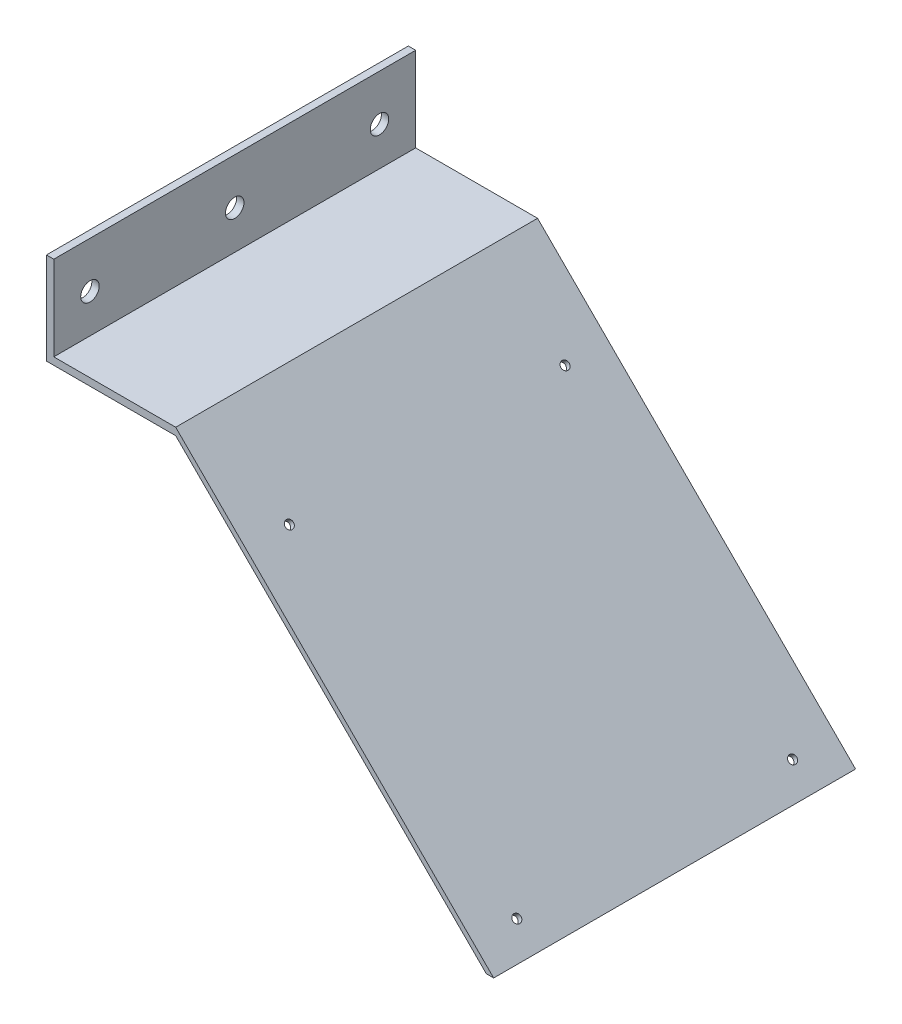
ISO-10303-21;
HEADER;
FILE_DESCRIPTION(('STEP AP214'),'2;1');
FILE_NAME('part.step','',(''),(''),'','','');
FILE_SCHEMA(('AUTOMOTIVE_DESIGN { 1 0 10303 214 1 1 1 1 }'));
ENDSEC;
DATA;
#1=APPLICATION_CONTEXT('core data for automotive mechanical design processes');
#2=APPLICATION_PROTOCOL_DEFINITION('international standard','automotive_design',2000,#1);
#3=PRODUCT_CONTEXT('',#1,'mechanical');
#4=PRODUCT('Part','Part','',(#3));
#5=PRODUCT_RELATED_PRODUCT_CATEGORY('part','',(#4));
#6=PRODUCT_DEFINITION_FORMATION('','',#4);
#7=PRODUCT_DEFINITION_CONTEXT('part definition',#1,'design');
#8=PRODUCT_DEFINITION('design','',#6,#7);
#9=PRODUCT_DEFINITION_SHAPE('','',#8);
#10=(LENGTH_UNIT() NAMED_UNIT(*) SI_UNIT(.MILLI.,.METRE.));
#11=(NAMED_UNIT(*) PLANE_ANGLE_UNIT() SI_UNIT($,.RADIAN.));
#12=(NAMED_UNIT(*) SI_UNIT($,.STERADIAN.) SOLID_ANGLE_UNIT());
#13=UNCERTAINTY_MEASURE_WITH_UNIT(LENGTH_MEASURE(1.E-05),#10,'distance_accuracy_value','');
#14=(GEOMETRIC_REPRESENTATION_CONTEXT(3) GLOBAL_UNCERTAINTY_ASSIGNED_CONTEXT((#13)) GLOBAL_UNIT_ASSIGNED_CONTEXT((#10,
#11,#12)) REPRESENTATION_CONTEXT('',''));
#15=CARTESIAN_POINT('',(0.,0.,0.));
#16=DIRECTION('',(0.,0.,1.));
#17=DIRECTION('',(1.,0.,0.));
#18=AXIS2_PLACEMENT_3D('',#15,#16,#17);
#19=CARTESIAN_POINT('',(0.,2.032,100.));
#20=DIRECTION('',(0.,-1.,0.));
#21=DIRECTION('',(1.,0.,0.));
#22=AXIS2_PLACEMENT_3D('',#19,#20,#21);
#23=PLANE('',#22);
#24=DIRECTION('',(-1.,0.,0.));
#25=VECTOR('',#24,1.);
#26=CARTESIAN_POINT('',(0.,2.032,0.));
#27=LINE('',#26,#25);
#28=CARTESIAN_POINT('',(0.,2.032,0.));
#29=VERTEX_POINT('',#28);
#30=CARTESIAN_POINT('',(-33.68957,2.032,0.));
#31=VERTEX_POINT('',#30);
#32=EDGE_CURVE('E150',#29,#31,#27,.T.);
#33=ORIENTED_EDGE('',*,*,#32,.T.);
#34=DIRECTION('',(0.,0.,-1.));
#35=VECTOR('',#34,1.);
#36=CARTESIAN_POINT('',(-33.68957,2.032,100.));
#37=LINE('',#36,#35);
#38=CARTESIAN_POINT('',(-33.68957,2.032,100.));
#39=VERTEX_POINT('',#38);
#40=EDGE_CURVE('E11',#39,#31,#37,.T.);
#41=ORIENTED_EDGE('',*,*,#40,.F.);
#42=DIRECTION('',(-1.,0.,0.));
#43=VECTOR('',#42,1.);
#44=CARTESIAN_POINT('',(0.,2.032,100.));
#45=LINE('',#44,#43);
#46=CARTESIAN_POINT('',(0.,2.032,100.));
#47=VERTEX_POINT('',#46);
#48=EDGE_CURVE('E177',#47,#39,#45,.T.);
#49=ORIENTED_EDGE('',*,*,#48,.F.);
#50=DIRECTION('',(0.,0.,-1.));
#51=VECTOR('',#50,1.);
#52=CARTESIAN_POINT('',(0.,2.032,100.));
#53=LINE('',#52,#51);
#54=EDGE_CURVE('E146',#47,#29,#53,.T.);
#55=ORIENTED_EDGE('',*,*,#54,.T.);
#56=EDGE_LOOP('',(#33,#41,#49,#55));
#57=FACE_BOUND('',#56,.T.);
#58=ADVANCED_FACE('F49',(#57),#23,.F.);
#59=CARTESIAN_POINT('',(-33.68957,0.,100.));
#60=DIRECTION('',(-1.,0.,0.));
#61=DIRECTION('',(0.,0.,1.));
#62=AXIS2_PLACEMENT_3D('',#59,#60,#61);
#63=PLANE('',#62);
#64=CARTESIAN_POINT('',(-33.68957,12.7,10.));
#65=DIRECTION('',(-1.,0.,0.));
#66=DIRECTION('',(0.,0.,1.));
#67=AXIS2_PLACEMENT_3D('',#64,#65,#66);
#68=CIRCLE('',#67,2.55269999999999);
#69=CARTESIAN_POINT('',(-33.68957,12.7,12.5527));
#70=VERTEX_POINT('',#69);
#71=EDGE_CURVE('E310',#70,#70,#68,.T.);
#72=ORIENTED_EDGE('',*,*,#71,.T.);
#73=EDGE_LOOP('',(#72));
#74=FACE_BOUND('',#73,.T.);
#75=CARTESIAN_POINT('',(-33.68957,12.7,50.));
#76=DIRECTION('',(-1.,0.,0.));
#77=DIRECTION('',(0.,0.,1.));
#78=AXIS2_PLACEMENT_3D('',#75,#76,#77);
#79=CIRCLE('',#78,2.55269999999999);
#80=CARTESIAN_POINT('',(-33.68957,12.7,52.5527));
#81=VERTEX_POINT('',#80);
#82=EDGE_CURVE('E302',#81,#81,#79,.T.);
#83=ORIENTED_EDGE('',*,*,#82,.T.);
#84=EDGE_LOOP('',(#83));
#85=FACE_BOUND('',#84,.T.);
#86=CARTESIAN_POINT('',(-33.68957,12.7,90.));
#87=DIRECTION('',(-1.,0.,0.));
#88=DIRECTION('',(0.,0.,1.));
#89=AXIS2_PLACEMENT_3D('',#86,#87,#88);
#90=CIRCLE('',#89,2.55269999999999);
#91=CARTESIAN_POINT('',(-33.68957,12.7,92.5527));
#92=VERTEX_POINT('',#91);
#93=EDGE_CURVE('E294',#92,#92,#90,.T.);
#94=ORIENTED_EDGE('',*,*,#93,.T.);
#95=EDGE_LOOP('',(#94));
#96=FACE_BOUND('',#95,.T.);
#97=DIRECTION('',(0.,1.,0.));
#98=VECTOR('',#97,1.);
#99=CARTESIAN_POINT('',(-33.68957,0.,0.));
#100=LINE('',#99,#98);
#101=CARTESIAN_POINT('',(-33.68957,25.4,0.));
#102=VERTEX_POINT('',#101);
#103=EDGE_CURVE('E154',#31,#102,#100,.T.);
#104=ORIENTED_EDGE('',*,*,#103,.T.);
#105=DIRECTION('',(0.,0.,-1.));
#106=VECTOR('',#105,1.);
#107=CARTESIAN_POINT('',(-33.68957,25.4,100.));
#108=LINE('',#107,#106);
#109=CARTESIAN_POINT('',(-33.68957,25.4,100.));
#110=VERTEX_POINT('',#109);
#111=EDGE_CURVE('E58',#110,#102,#108,.T.);
#112=ORIENTED_EDGE('',*,*,#111,.F.);
#113=DIRECTION('',(0.,1.,0.));
#114=VECTOR('',#113,1.);
#115=CARTESIAN_POINT('',(-33.68957,0.,100.));
#116=LINE('',#115,#114);
#117=EDGE_CURVE('E109',#39,#110,#116,.T.);
#118=ORIENTED_EDGE('',*,*,#117,.F.);
#119=ORIENTED_EDGE('',*,*,#40,.T.);
#120=EDGE_LOOP('',(#104,#112,#118,#119));
#121=FACE_BOUND('',#120,.T.);
#122=ADVANCED_FACE('F196',(#74,#85,#96,#121),#63,.F.);
#123=CARTESIAN_POINT('',(0.,25.4,100.));
#124=DIRECTION('',(0.,1.,0.));
#125=DIRECTION('',(0.,0.,1.));
#126=AXIS2_PLACEMENT_3D('',#123,#124,#125);
#127=PLANE('',#126);
#128=DIRECTION('',(1.,0.,0.));
#129=VECTOR('',#128,1.);
#130=CARTESIAN_POINT('',(0.,25.4,0.));
#131=LINE('',#130,#129);
#132=CARTESIAN_POINT('',(-35.72157,25.4,0.));
#133=VERTEX_POINT('',#132);
#134=EDGE_CURVE('E159',#133,#102,#131,.T.);
#135=ORIENTED_EDGE('',*,*,#134,.F.);
#136=DIRECTION('',(0.,0.,-1.));
#137=VECTOR('',#136,1.);
#138=CARTESIAN_POINT('',(-35.72157,25.4,100.));
#139=LINE('',#138,#137);
#140=CARTESIAN_POINT('',(-35.72157,25.4,100.));
#141=VERTEX_POINT('',#140);
#142=EDGE_CURVE('E187',#141,#133,#139,.T.);
#143=ORIENTED_EDGE('',*,*,#142,.F.);
#144=DIRECTION('',(1.,0.,0.));
#145=VECTOR('',#144,1.);
#146=CARTESIAN_POINT('',(0.,25.4,100.));
#147=LINE('',#146,#145);
#148=EDGE_CURVE('E195',#141,#110,#147,.T.);
#149=ORIENTED_EDGE('',*,*,#148,.T.);
#150=ORIENTED_EDGE('',*,*,#111,.T.);
#151=EDGE_LOOP('',(#135,#143,#149,#150));
#152=FACE_BOUND('',#151,.T.);
#153=ADVANCED_FACE('F193',(#152),#127,.T.);
#154=CARTESIAN_POINT('',(-35.72157,0.,100.));
#155=DIRECTION('',(-1.,0.,0.));
#156=DIRECTION('',(0.,0.,1.));
#157=AXIS2_PLACEMENT_3D('',#154,#155,#156);
#158=PLANE('',#157);
#159=CARTESIAN_POINT('',(-35.72157,12.7,10.));
#160=DIRECTION('',(-1.,0.,0.));
#161=DIRECTION('',(0.,0.,1.));
#162=AXIS2_PLACEMENT_3D('',#159,#160,#161);
#163=CIRCLE('',#162,2.5527);
#164=CARTESIAN_POINT('',(-35.72157,12.7,12.5527));
#165=VERTEX_POINT('',#164);
#166=EDGE_CURVE('E313',#165,#165,#163,.T.);
#167=ORIENTED_EDGE('',*,*,#166,.F.);
#168=EDGE_LOOP('',(#167));
#169=FACE_BOUND('',#168,.T.);
#170=CARTESIAN_POINT('',(-35.72157,12.7,50.));
#171=DIRECTION('',(-1.,0.,0.));
#172=DIRECTION('',(0.,0.,1.));
#173=AXIS2_PLACEMENT_3D('',#170,#171,#172);
#174=CIRCLE('',#173,2.5527);
#175=CARTESIAN_POINT('',(-35.72157,12.7,52.5527));
#176=VERTEX_POINT('',#175);
#177=EDGE_CURVE('E306',#176,#176,#174,.T.);
#178=ORIENTED_EDGE('',*,*,#177,.F.);
#179=EDGE_LOOP('',(#178));
#180=FACE_BOUND('',#179,.T.);
#181=CARTESIAN_POINT('',(-35.72157,12.7,90.));
#182=DIRECTION('',(-1.,0.,0.));
#183=DIRECTION('',(0.,0.,1.));
#184=AXIS2_PLACEMENT_3D('',#181,#182,#183);
#185=CIRCLE('',#184,2.5527);
#186=CARTESIAN_POINT('',(-35.72157,12.7,92.5527));
#187=VERTEX_POINT('',#186);
#188=EDGE_CURVE('E298',#187,#187,#185,.T.);
#189=ORIENTED_EDGE('',*,*,#188,.F.);
#190=EDGE_LOOP('',(#189));
#191=FACE_BOUND('',#190,.T.);
#192=DIRECTION('',(0.,1.,0.));
#193=VECTOR('',#192,1.);
#194=CARTESIAN_POINT('',(-35.72157,0.,0.));
#195=LINE('',#194,#193);
#196=CARTESIAN_POINT('',(-35.72157,0.,0.));
#197=VERTEX_POINT('',#196);
#198=EDGE_CURVE('E163',#197,#133,#195,.T.);
#199=ORIENTED_EDGE('',*,*,#198,.F.);
#200=DIRECTION('',(0.,0.,-1.));
#201=VECTOR('',#200,1.);
#202=CARTESIAN_POINT('',(-35.72157,0.,100.));
#203=LINE('',#202,#201);
#204=CARTESIAN_POINT('',(-35.72157,0.,100.));
#205=VERTEX_POINT('',#204);
#206=EDGE_CURVE('E184',#205,#197,#203,.T.);
#207=ORIENTED_EDGE('',*,*,#206,.F.);
#208=DIRECTION('',(0.,1.,0.));
#209=VECTOR('',#208,1.);
#210=CARTESIAN_POINT('',(-35.72157,0.,100.));
#211=LINE('',#210,#209);
#212=EDGE_CURVE('E206',#205,#141,#211,.T.);
#213=ORIENTED_EDGE('',*,*,#212,.T.);
#214=ORIENTED_EDGE('',*,*,#142,.T.);
#215=EDGE_LOOP('',(#199,#207,#213,#214));
#216=FACE_BOUND('',#215,.T.);
#217=ADVANCED_FACE('F204',(#169,#180,#191,#216),#158,.T.);
#218=CARTESIAN_POINT('',(0.,0.,100.));
#219=DIRECTION('',(0.,-1.,0.));
#220=DIRECTION('',(1.,0.,0.));
#221=AXIS2_PLACEMENT_3D('',#218,#219,#220);
#222=PLANE('',#221);
#223=DIRECTION('',(-1.,0.,0.));
#224=VECTOR('',#223,1.);
#225=CARTESIAN_POINT('',(0.,0.,0.));
#226=LINE('',#225,#224);
#227=CARTESIAN_POINT('',(0.,0.,0.));
#228=VERTEX_POINT('',#227);
#229=EDGE_CURVE('E167',#228,#197,#226,.T.);
#230=ORIENTED_EDGE('',*,*,#229,.F.);
#231=DIRECTION('',(0.,0.,-1.));
#232=VECTOR('',#231,1.);
#233=CARTESIAN_POINT('',(0.,0.,100.));
#234=LINE('',#233,#232);
#235=CARTESIAN_POINT('',(0.,0.,100.));
#236=VERTEX_POINT('',#235);
#237=EDGE_CURVE('E139',#236,#228,#234,.T.);
#238=ORIENTED_EDGE('',*,*,#237,.F.);
#239=DIRECTION('',(-1.,0.,0.));
#240=VECTOR('',#239,1.);
#241=CARTESIAN_POINT('',(0.,0.,100.));
#242=LINE('',#241,#240);
#243=EDGE_CURVE('E130',#236,#205,#242,.T.);
#244=ORIENTED_EDGE('',*,*,#243,.T.);
#245=ORIENTED_EDGE('',*,*,#206,.T.);
#246=EDGE_LOOP('',(#230,#238,#244,#245));
#247=FACE_BOUND('',#246,.T.);
#248=ADVANCED_FACE('F216',(#247),#222,.T.);
#249=CARTESIAN_POINT('',(0.,0.,100.));
#250=DIRECTION('',(0.707106781186546,0.707106781186549,0.));
#251=DIRECTION('',(-0.707106781186549,0.707106781186546,0.));
#252=AXIS2_PLACEMENT_3D('',#249,#250,#251);
#253=PLANE('',#252);
#254=CARTESIAN_POINT('',(18.4816506323928,-18.4816506323927,88.1));
#255=DIRECTION('',(0.707106781186546,0.707106781186549,0.));
#256=DIRECTION('',(-0.707106781186549,0.707106781186546,0.));
#257=AXIS2_PLACEMENT_3D('',#254,#255,#256);
#258=CIRCLE('',#257,1.13029999999999);
#259=CARTESIAN_POINT('',(17.6824078376176,-17.6824078376175,88.1));
#260=VERTEX_POINT('',#259);
#261=EDGE_CURVE('E256',#260,#260,#258,.T.);
#262=ORIENTED_EDGE('',*,*,#261,.T.);
#263=EDGE_LOOP('',(#262));
#264=FACE_BOUND('',#263,.T.);
#265=CARTESIAN_POINT('',(18.4816506323928,-18.4816506323927,11.9));
#266=DIRECTION('',(0.707106781186546,0.707106781186549,0.));
#267=DIRECTION('',(-0.707106781186549,0.707106781186546,0.));
#268=AXIS2_PLACEMENT_3D('',#265,#266,#267);
#269=CIRCLE('',#268,1.13029999999999);
#270=CARTESIAN_POINT('',(17.6824078376176,-17.6824078376175,11.9));
#271=VERTEX_POINT('',#270);
#272=EDGE_CURVE('E260',#271,#271,#269,.T.);
#273=ORIENTED_EDGE('',*,*,#272,.T.);
#274=EDGE_LOOP('',(#273));
#275=FACE_BOUND('',#274,.T.);
#276=CARTESIAN_POINT('',(81.343443479877,-81.3434434798766,11.9));
#277=DIRECTION('',(0.707106781186546,0.707106781186549,0.));
#278=DIRECTION('',(-0.707106781186549,0.707106781186546,0.));
#279=AXIS2_PLACEMENT_3D('',#276,#277,#278);
#280=CIRCLE('',#279,1.13029999999999);
#281=CARTESIAN_POINT('',(80.5442006851018,-80.5442006851015,11.9));
#282=VERTEX_POINT('',#281);
#283=EDGE_CURVE('E264',#282,#282,#280,.T.);
#284=ORIENTED_EDGE('',*,*,#283,.T.);
#285=EDGE_LOOP('',(#284));
#286=FACE_BOUND('',#285,.T.);
#287=CARTESIAN_POINT('',(81.343443479877,-81.3434434798766,88.1));
#288=DIRECTION('',(0.707106781186546,0.707106781186549,0.));
#289=DIRECTION('',(-0.707106781186549,0.707106781186546,0.));
#290=AXIS2_PLACEMENT_3D('',#287,#288,#289);
#291=CIRCLE('',#290,1.13029999999999);
#292=CARTESIAN_POINT('',(80.5442006851018,-80.5442006851015,88.1));
#293=VERTEX_POINT('',#292);
#294=EDGE_CURVE('E155',#293,#293,#291,.T.);
#295=ORIENTED_EDGE('',*,*,#294,.T.);
#296=EDGE_LOOP('',(#295));
#297=FACE_BOUND('',#296,.T.);
#298=DIRECTION('',(0.707106781186549,-0.707106781186546,0.));
#299=VECTOR('',#298,1.);
#300=CARTESIAN_POINT('',(0.,0.,0.));
#301=LINE('',#300,#299);
#302=CARTESIAN_POINT('',(85.8335708478916,-85.8335708478913,0.));
#303=VERTEX_POINT('',#302);
#304=EDGE_CURVE('E137',#228,#303,#301,.T.);
#305=ORIENTED_EDGE('',*,*,#304,.T.);
#306=DIRECTION('',(0.,0.,-1.));
#307=VECTOR('',#306,1.);
#308=CARTESIAN_POINT('',(85.8335708478916,-85.8335708478913,100.));
#309=LINE('',#308,#307);
#310=CARTESIAN_POINT('',(85.8335708478916,-85.8335708478913,100.));
#311=VERTEX_POINT('',#310);
#312=EDGE_CURVE('E134',#311,#303,#309,.T.);
#313=ORIENTED_EDGE('',*,*,#312,.F.);
#314=DIRECTION('',(0.707106781186549,-0.707106781186546,0.));
#315=VECTOR('',#314,1.);
#316=CARTESIAN_POINT('',(0.,0.,100.));
#317=LINE('',#316,#315);
#318=EDGE_CURVE('E123',#236,#311,#317,.T.);
#319=ORIENTED_EDGE('',*,*,#318,.F.);
#320=ORIENTED_EDGE('',*,*,#237,.T.);
#321=EDGE_LOOP('',(#305,#313,#319,#320));
#322=FACE_BOUND('',#321,.T.);
#323=ADVANCED_FACE('F135',(#264,#275,#286,#297,#322),#253,.F.);
#324=CARTESIAN_POINT('',(1.17242134154927E-12,-85.8335708478924,100.));
#325=DIRECTION('',(0.,1.,0.));
#326=DIRECTION('',(-1.,0.,0.));
#327=AXIS2_PLACEMENT_3D('',#324,#325,#326);
#328=PLANE('',#327);
#329=DIRECTION('',(1.,0.,0.));
#330=VECTOR('',#329,1.);
#331=CARTESIAN_POINT('',(1.17242134154927E-12,-85.8335708478924,0.));
#332=LINE('',#331,#330);
#333=CARTESIAN_POINT('',(87.8655708478916,-85.8335708478912,0.));
#334=VERTEX_POINT('',#333);
#335=EDGE_CURVE('E95',#303,#334,#332,.T.);
#336=ORIENTED_EDGE('',*,*,#335,.T.);
#337=DIRECTION('',(0.,0.,-1.));
#338=VECTOR('',#337,1.);
#339=CARTESIAN_POINT('',(87.8655708478916,-85.8335708478912,100.));
#340=LINE('',#339,#338);
#341=CARTESIAN_POINT('',(87.8655708478916,-85.8335708478912,100.));
#342=VERTEX_POINT('',#341);
#343=EDGE_CURVE('E140',#342,#334,#340,.T.);
#344=ORIENTED_EDGE('',*,*,#343,.F.);
#345=DIRECTION('',(1.,0.,0.));
#346=VECTOR('',#345,1.);
#347=CARTESIAN_POINT('',(1.17242134154927E-12,-85.8335708478924,100.));
#348=LINE('',#347,#346);
#349=EDGE_CURVE('E127',#311,#342,#348,.T.);
#350=ORIENTED_EDGE('',*,*,#349,.F.);
#351=ORIENTED_EDGE('',*,*,#312,.T.);
#352=EDGE_LOOP('',(#336,#344,#350,#351));
#353=FACE_BOUND('',#352,.T.);
#354=ADVANCED_FACE('F142',(#353),#328,.F.);
#355=CARTESIAN_POINT('',(1.01599999999998,1.01599999999999,100.));
#356=DIRECTION('',(-0.707106781186546,-0.707106781186549,0.));
#357=DIRECTION('',(0.707106781186549,-0.707106781186546,0.));
#358=AXIS2_PLACEMENT_3D('',#355,#356,#357);
#359=PLANE('',#358);
#360=CARTESIAN_POINT('',(19.4976506323928,-17.4656506323927,88.1));
#361=DIRECTION('',(0.707106781186546,0.707106781186549,0.));
#362=DIRECTION('',(-0.707106781186549,0.707106781186546,0.));
#363=AXIS2_PLACEMENT_3D('',#360,#361,#362);
#364=CIRCLE('',#363,1.1303);
#365=CARTESIAN_POINT('',(18.6984078376176,-16.6664078376175,88.1));
#366=VERTEX_POINT('',#365);
#367=EDGE_CURVE('E290',#366,#366,#364,.T.);
#368=ORIENTED_EDGE('',*,*,#367,.F.);
#369=EDGE_LOOP('',(#368));
#370=FACE_BOUND('',#369,.T.);
#371=CARTESIAN_POINT('',(19.4976506323928,-17.4656506323927,11.9));
#372=DIRECTION('',(0.707106781186546,0.707106781186549,0.));
#373=DIRECTION('',(-0.707106781186549,0.707106781186546,0.));
#374=AXIS2_PLACEMENT_3D('',#371,#372,#373);
#375=CIRCLE('',#374,1.1303);
#376=CARTESIAN_POINT('',(18.6984078376176,-16.6664078376175,11.9));
#377=VERTEX_POINT('',#376);
#378=EDGE_CURVE('E284',#377,#377,#375,.T.);
#379=ORIENTED_EDGE('',*,*,#378,.F.);
#380=EDGE_LOOP('',(#379));
#381=FACE_BOUND('',#380,.T.);
#382=CARTESIAN_POINT('',(82.3594434798771,-80.3274434798765,11.9));
#383=DIRECTION('',(0.707106781186546,0.707106781186549,0.));
#384=DIRECTION('',(-0.707106781186549,0.707106781186546,0.));
#385=AXIS2_PLACEMENT_3D('',#382,#383,#384);
#386=CIRCLE('',#385,1.1303);
#387=CARTESIAN_POINT('',(81.560200685102,-79.5282006851013,11.9));
#388=VERTEX_POINT('',#387);
#389=EDGE_CURVE('E278',#388,#388,#386,.T.);
#390=ORIENTED_EDGE('',*,*,#389,.F.);
#391=EDGE_LOOP('',(#390));
#392=FACE_BOUND('',#391,.T.);
#393=CARTESIAN_POINT('',(82.3594434798771,-80.3274434798765,88.1));
#394=DIRECTION('',(0.707106781186546,0.707106781186549,0.));
#395=DIRECTION('',(-0.707106781186549,0.707106781186546,0.));
#396=AXIS2_PLACEMENT_3D('',#393,#394,#395);
#397=CIRCLE('',#396,1.1303);
#398=CARTESIAN_POINT('',(81.560200685102,-79.5282006851013,88.1));
#399=VERTEX_POINT('',#398);
#400=EDGE_CURVE('E269',#399,#399,#397,.T.);
#401=ORIENTED_EDGE('',*,*,#400,.F.);
#402=EDGE_LOOP('',(#401));
#403=FACE_BOUND('',#402,.T.);
#404=DIRECTION('',(-0.707106781186549,0.707106781186546,0.));
#405=VECTOR('',#404,1.);
#406=CARTESIAN_POINT('',(1.01599999999998,1.01599999999999,0.));
#407=LINE('',#406,#405);
#408=EDGE_CURVE('E101',#334,#29,#407,.T.);
#409=ORIENTED_EDGE('',*,*,#408,.T.);
#410=ORIENTED_EDGE('',*,*,#54,.F.);
#411=DIRECTION('',(-0.707106781186549,0.707106781186546,0.));
#412=VECTOR('',#411,1.);
#413=CARTESIAN_POINT('',(1.01599999999998,1.01599999999999,100.));
#414=LINE('',#413,#412);
#415=EDGE_CURVE('E66',#342,#47,#414,.T.);
#416=ORIENTED_EDGE('',*,*,#415,.F.);
#417=ORIENTED_EDGE('',*,*,#343,.T.);
#418=EDGE_LOOP('',(#409,#410,#416,#417));
#419=FACE_BOUND('',#418,.T.);
#420=ADVANCED_FACE('F219',(#370,#381,#392,#403,#419),#359,.F.);
#421=CARTESIAN_POINT('',(0.,0.,100.));
#422=DIRECTION('',(0.,0.,1.));
#423=DIRECTION('',(1.,0.,0.));
#424=AXIS2_PLACEMENT_3D('',#421,#422,#423);
#425=PLANE('',#424);
#426=ORIENTED_EDGE('',*,*,#48,.T.);
#427=ORIENTED_EDGE('',*,*,#117,.T.);
#428=ORIENTED_EDGE('',*,*,#148,.F.);
#429=ORIENTED_EDGE('',*,*,#212,.F.);
#430=ORIENTED_EDGE('',*,*,#243,.F.);
#431=ORIENTED_EDGE('',*,*,#318,.T.);
#432=ORIENTED_EDGE('',*,*,#349,.T.);
#433=ORIENTED_EDGE('',*,*,#415,.T.);
#434=EDGE_LOOP('',(#426,#427,#428,#429,#430,#431,#432,#433));
#435=FACE_BOUND('',#434,.T.);
#436=ADVANCED_FACE('F125',(#435),#425,.T.);
#437=CARTESIAN_POINT('',(0.,0.,0.));
#438=DIRECTION('',(0.,0.,1.));
#439=DIRECTION('',(1.,0.,0.));
#440=AXIS2_PLACEMENT_3D('',#437,#438,#439);
#441=PLANE('',#440);
#442=ORIENTED_EDGE('',*,*,#32,.F.);
#443=ORIENTED_EDGE('',*,*,#408,.F.);
#444=ORIENTED_EDGE('',*,*,#335,.F.);
#445=ORIENTED_EDGE('',*,*,#304,.F.);
#446=ORIENTED_EDGE('',*,*,#229,.T.);
#447=ORIENTED_EDGE('',*,*,#198,.T.);
#448=ORIENTED_EDGE('',*,*,#134,.T.);
#449=ORIENTED_EDGE('',*,*,#103,.F.);
#450=EDGE_LOOP('',(#442,#443,#444,#445,#446,#447,#448,#449));
#451=FACE_BOUND('',#450,.T.);
#452=ADVANCED_FACE('F200',(#451),#441,.F.);
#453=CARTESIAN_POINT('',(82.3594434798771,-80.3274434798765,88.1));
#454=DIRECTION('',(0.707106781186546,0.707106781186549,0.));
#455=DIRECTION('',(-0.707106781186549,0.707106781186546,0.));
#456=AXIS2_PLACEMENT_3D('',#453,#454,#455);
#457=CYLINDRICAL_SURFACE('',#456,1.13029999999999);
#458=ORIENTED_EDGE('',*,*,#400,.T.);
#459=EDGE_LOOP('',(#458));
#460=FACE_BOUND('',#459,.T.);
#461=ORIENTED_EDGE('',*,*,#294,.F.);
#462=EDGE_LOOP('',(#461));
#463=FACE_BOUND('',#462,.T.);
#464=ADVANCED_FACE('F350',(#460,#463),#457,.F.);
#465=CARTESIAN_POINT('',(82.3594434798771,-80.3274434798765,11.9));
#466=DIRECTION('',(0.707106781186546,0.707106781186549,0.));
#467=DIRECTION('',(-0.707106781186549,0.707106781186546,0.));
#468=AXIS2_PLACEMENT_3D('',#465,#466,#467);
#469=CYLINDRICAL_SURFACE('',#468,1.13029999999999);
#470=ORIENTED_EDGE('',*,*,#389,.T.);
#471=EDGE_LOOP('',(#470));
#472=FACE_BOUND('',#471,.T.);
#473=ORIENTED_EDGE('',*,*,#283,.F.);
#474=EDGE_LOOP('',(#473));
#475=FACE_BOUND('',#474,.T.);
#476=ADVANCED_FACE('F346',(#472,#475),#469,.F.);
#477=CARTESIAN_POINT('',(19.4976506323928,-17.4656506323927,11.9));
#478=DIRECTION('',(0.707106781186546,0.707106781186549,0.));
#479=DIRECTION('',(-0.707106781186549,0.707106781186546,0.));
#480=AXIS2_PLACEMENT_3D('',#477,#478,#479);
#481=CYLINDRICAL_SURFACE('',#480,1.13029999999999);
#482=ORIENTED_EDGE('',*,*,#378,.T.);
#483=EDGE_LOOP('',(#482));
#484=FACE_BOUND('',#483,.T.);
#485=ORIENTED_EDGE('',*,*,#272,.F.);
#486=EDGE_LOOP('',(#485));
#487=FACE_BOUND('',#486,.T.);
#488=ADVANCED_FACE('F339',(#484,#487),#481,.F.);
#489=CARTESIAN_POINT('',(19.4976506323928,-17.4656506323927,88.1));
#490=DIRECTION('',(0.707106781186546,0.707106781186549,0.));
#491=DIRECTION('',(-0.707106781186549,0.707106781186546,0.));
#492=AXIS2_PLACEMENT_3D('',#489,#490,#491);
#493=CYLINDRICAL_SURFACE('',#492,1.13029999999999);
#494=ORIENTED_EDGE('',*,*,#367,.T.);
#495=EDGE_LOOP('',(#494));
#496=FACE_BOUND('',#495,.T.);
#497=ORIENTED_EDGE('',*,*,#261,.F.);
#498=EDGE_LOOP('',(#497));
#499=FACE_BOUND('',#498,.T.);
#500=ADVANCED_FACE('F329',(#496,#499),#493,.F.);
#501=CARTESIAN_POINT('',(-35.72157,12.7,90.));
#502=DIRECTION('',(-1.,0.,0.));
#503=DIRECTION('',(0.,0.,1.));
#504=AXIS2_PLACEMENT_3D('',#501,#502,#503);
#505=CYLINDRICAL_SURFACE('',#504,2.55269999999999);
#506=ORIENTED_EDGE('',*,*,#188,.T.);
#507=EDGE_LOOP('',(#506));
#508=FACE_BOUND('',#507,.T.);
#509=ORIENTED_EDGE('',*,*,#93,.F.);
#510=EDGE_LOOP('',(#509));
#511=FACE_BOUND('',#510,.T.);
#512=ADVANCED_FACE('F325',(#508,#511),#505,.F.);
#513=CARTESIAN_POINT('',(-35.72157,12.7,50.));
#514=DIRECTION('',(-1.,0.,0.));
#515=DIRECTION('',(0.,0.,1.));
#516=AXIS2_PLACEMENT_3D('',#513,#514,#515);
#517=CYLINDRICAL_SURFACE('',#516,2.55269999999999);
#518=ORIENTED_EDGE('',*,*,#177,.T.);
#519=EDGE_LOOP('',(#518));
#520=FACE_BOUND('',#519,.T.);
#521=ORIENTED_EDGE('',*,*,#82,.F.);
#522=EDGE_LOOP('',(#521));
#523=FACE_BOUND('',#522,.T.);
#524=ADVANCED_FACE('F328',(#520,#523),#517,.F.);
#525=CARTESIAN_POINT('',(-35.72157,12.7,10.));
#526=DIRECTION('',(-1.,0.,0.));
#527=DIRECTION('',(0.,0.,1.));
#528=AXIS2_PLACEMENT_3D('',#525,#526,#527);
#529=CYLINDRICAL_SURFACE('',#528,2.55269999999999);
#530=ORIENTED_EDGE('',*,*,#166,.T.);
#531=EDGE_LOOP('',(#530));
#532=FACE_BOUND('',#531,.T.);
#533=ORIENTED_EDGE('',*,*,#71,.F.);
#534=EDGE_LOOP('',(#533));
#535=FACE_BOUND('',#534,.T.);
#536=ADVANCED_FACE('F318',(#532,#535),#529,.F.);
#537=CLOSED_SHELL('',(#58,#122,#153,#217,#248,#323,#354,#420,#436,#452,#464,#476,#488,#500,#512,
#524,#536));
#538=MANIFOLD_SOLID_BREP('B2',#537);
#539=ADVANCED_BREP_SHAPE_REPRESENTATION('',(#18,#538),#14);
#540=SHAPE_DEFINITION_REPRESENTATION(#9,#539);
ENDSEC;
END-ISO-10303-21;
